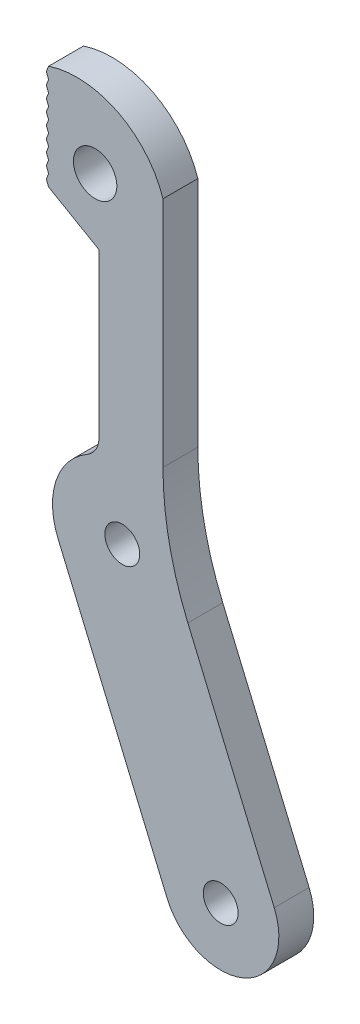
ISO-10303-21;
HEADER;
FILE_DESCRIPTION(('STEP AP214'),'2;1');
FILE_NAME('part.step','',(''),(''),'','','');
FILE_SCHEMA(('AUTOMOTIVE_DESIGN { 1 0 10303 214 1 1 1 1 }'));
ENDSEC;
DATA;
#1=APPLICATION_CONTEXT('core data for automotive mechanical design processes');
#2=APPLICATION_PROTOCOL_DEFINITION('international standard','automotive_design',2000,#1);
#3=PRODUCT_CONTEXT('',#1,'mechanical');
#4=PRODUCT('Part','Part','',(#3));
#5=PRODUCT_RELATED_PRODUCT_CATEGORY('part','',(#4));
#6=PRODUCT_DEFINITION_FORMATION('','',#4);
#7=PRODUCT_DEFINITION_CONTEXT('part definition',#1,'design');
#8=PRODUCT_DEFINITION('design','',#6,#7);
#9=PRODUCT_DEFINITION_SHAPE('','',#8);
#10=(LENGTH_UNIT() NAMED_UNIT(*) SI_UNIT(.MILLI.,.METRE.));
#11=(NAMED_UNIT(*) PLANE_ANGLE_UNIT() SI_UNIT($,.RADIAN.));
#12=(NAMED_UNIT(*) SI_UNIT($,.STERADIAN.) SOLID_ANGLE_UNIT());
#13=UNCERTAINTY_MEASURE_WITH_UNIT(LENGTH_MEASURE(1.E-05),#10,'distance_accuracy_value','');
#14=(GEOMETRIC_REPRESENTATION_CONTEXT(3) GLOBAL_UNCERTAINTY_ASSIGNED_CONTEXT((#13)) GLOBAL_UNIT_ASSIGNED_CONTEXT((#10,
#11,#12)) REPRESENTATION_CONTEXT('',''));
#15=CARTESIAN_POINT('',(0.,0.,0.));
#16=DIRECTION('',(0.,0.,1.));
#17=DIRECTION('',(1.,0.,0.));
#18=AXIS2_PLACEMENT_3D('',#15,#16,#17);
#19=CARTESIAN_POINT('',(18.0632491834591,-3.57873370652173,3.));
#20=DIRECTION('',(0.,0.,-1.));
#21=DIRECTION('',(-1.,0.,0.));
#22=AXIS2_PLACEMENT_3D('',#19,#20,#21);
#23=PLANE('',#22);
#24=CARTESIAN_POINT('',(30.4181785626427,-51.0948843433533,3.));
#25=DIRECTION('',(0.,0.,1.));
#26=DIRECTION('',(1.,0.,0.));
#27=AXIS2_PLACEMENT_3D('',#24,#25,#26);
#28=CIRCLE('',#27,1.5);
#29=CARTESIAN_POINT('',(31.9181785626427,-51.0948843433533,3.));
#30=VERTEX_POINT('',#29);
#31=EDGE_CURVE('E494',#30,#30,#28,.T.);
#32=ORIENTED_EDGE('',*,*,#31,.F.);
#33=EDGE_LOOP('',(#32));
#34=FACE_BOUND('',#33,.T.);
#35=DIRECTION('',(0.86602540378444,-0.499999999999997,0.));
#36=VECTOR('',#35,1.);
#37=CARTESIAN_POINT('',(19.9553284785627,-7.68665441141795,3.));
#38=LINE('',#37,#36);
#39=CARTESIAN_POINT('',(15.6252014596405,-5.18665441141796,3.));
#40=VERTEX_POINT('',#39);
#41=CARTESIAN_POINT('',(19.9553284785627,-7.68665441141795,3.));
#42=VERTEX_POINT('',#41);
#43=EDGE_CURVE('E304',#40,#42,#38,.T.);
#44=ORIENTED_EDGE('',*,*,#43,.T.);
#45=DIRECTION('',(0.,-1.,0.));
#46=VECTOR('',#45,1.);
#47=CARTESIAN_POINT('',(19.9553284785627,-21.6866544114179,3.));
#48=LINE('',#47,#46);
#49=CARTESIAN_POINT('',(19.9553284785627,-21.6866544114179,3.));
#50=VERTEX_POINT('',#49);
#51=EDGE_CURVE('E152',#42,#50,#48,.T.);
#52=ORIENTED_EDGE('',*,*,#51,.T.);
#53=CARTESIAN_POINT('',(17.9553284785627,-21.6866544114179,3.));
#54=DIRECTION('',(0.,0.,-1.));
#55=DIRECTION('',(-1.,0.,0.));
#56=AXIS2_PLACEMENT_3D('',#53,#54,#55);
#57=CIRCLE('',#56,2.);
#58=CARTESIAN_POINT('',(18.9561176597661,-23.418249345225,3.));
#59=VERTEX_POINT('',#58);
#60=EDGE_CURVE('E379',#50,#59,#57,.T.);
#61=ORIENTED_EDGE('',*,*,#60,.T.);
#62=CARTESIAN_POINT('',(21.9584852033763,-28.6130341466461,3.));
#63=DIRECTION('',(0.,0.,1.));
#64=DIRECTION('',(1.,0.,0.));
#65=AXIS2_PLACEMENT_3D('',#62,#63,#64);
#66=CIRCLE('',#65,6.);
#67=CARTESIAN_POINT('',(16.4357325722321,-30.9580721794271,3.));
#68=VERTEX_POINT('',#67);
#69=EDGE_CURVE('E398',#59,#68,#66,.T.);
#70=ORIENTED_EDGE('',*,*,#69,.T.);
#71=DIRECTION('',(0.390839672130157,-0.920458771857377,0.));
#72=VECTOR('',#71,1.);
#73=CARTESIAN_POINT('',(16.4357325722321,-30.9580721794271,3.));
#74=LINE('',#73,#72);
#75=CARTESIAN_POINT('',(25.8158847033558,-53.0490827040041,3.));
#76=VERTEX_POINT('',#75);
#77=EDGE_CURVE('E395',#68,#76,#74,.T.);
#78=ORIENTED_EDGE('',*,*,#77,.T.);
#79=CARTESIAN_POINT('',(30.4181785626427,-51.0948843433533,3.));
#80=DIRECTION('',(0.,0.,1.));
#81=DIRECTION('',(1.,0.,0.));
#82=AXIS2_PLACEMENT_3D('',#79,#80,#81);
#83=CIRCLE('',#82,5.);
#84=CARTESIAN_POINT('',(35.0204724219296,-49.1406859827026,3.));
#85=VERTEX_POINT('',#84);
#86=EDGE_CURVE('E397',#76,#85,#83,.T.);
#87=ORIENTED_EDGE('',*,*,#86,.T.);
#88=DIRECTION('',(-0.390839672130157,0.920458771857378,0.));
#89=VECTOR('',#88,1.);
#90=CARTESIAN_POINT('',(35.0204724219296,-49.1406859827026,3.));
#91=LINE('',#90,#89);
#92=CARTESIAN_POINT('',(27.5945186514566,-31.6519693174124,3.));
#93=VERTEX_POINT('',#92);
#94=EDGE_CURVE('E400',#85,#93,#91,.T.);
#95=ORIENTED_EDGE('',*,*,#94,.T.);
#96=CARTESIAN_POINT('',(52.3494338732919,-21.1406859827026,3.));
#97=DIRECTION('',(0.,0.,-1.));
#98=DIRECTION('',(-1.,0.,0.));
#99=AXIS2_PLACEMENT_3D('',#96,#97,#98);
#100=CIRCLE('',#99,26.8941053947292);
#101=CARTESIAN_POINT('',(25.4553284785627,-21.1406859827026,3.));
#102=VERTEX_POINT('',#101);
#103=EDGE_CURVE('E406',#93,#102,#100,.T.);
#104=ORIENTED_EDGE('',*,*,#103,.T.);
#105=DIRECTION('',(0.,1.,0.));
#106=VECTOR('',#105,1.);
#107=CARTESIAN_POINT('',(25.4553284785627,-21.1406859827026,3.));
#108=LINE('',#107,#106);
#109=CARTESIAN_POINT('',(25.4553284785627,-1.14068598270257,3.));
#110=VERTEX_POINT('',#109);
#111=EDGE_CURVE('E408',#102,#110,#108,.T.);
#112=ORIENTED_EDGE('',*,*,#111,.T.);
#113=CARTESIAN_POINT('',(18.0632491834591,-3.57873370652173,3.));
#114=DIRECTION('',(0.,0.,1.));
#115=DIRECTION('',(-1.,0.,0.));
#116=AXIS2_PLACEMENT_3D('',#113,#114,#115);
#117=CIRCLE('',#116,7.78375956776151);
#118=CARTESIAN_POINT('',(15.6252014596405,3.81334558858203,3.));
#119=VERTEX_POINT('',#118);
#120=EDGE_CURVE('E410',#110,#119,#117,.T.);
#121=ORIENTED_EDGE('',*,*,#120,.T.);
#122=DIRECTION('',(-0.37139067635417,-0.928476690885233,0.));
#123=VECTOR('',#122,1.);
#124=CARTESIAN_POINT('',(15.4252014596405,3.31334558858206,3.));
#125=LINE('',#124,#123);
#126=CARTESIAN_POINT('',(15.4252014596405,3.31334558858206,3.));
#127=VERTEX_POINT('',#126);
#128=EDGE_CURVE('E412',#119,#127,#125,.T.);
#129=ORIENTED_EDGE('',*,*,#128,.T.);
#130=DIRECTION('',(0.371390676354105,-0.928476690885259,0.));
#131=VECTOR('',#130,1.);
#132=CARTESIAN_POINT('',(15.4252014596405,3.31334558858206,3.));
#133=LINE('',#132,#131);
#134=CARTESIAN_POINT('',(15.6252014596405,2.81334558858206,3.));
#135=VERTEX_POINT('',#134);
#136=EDGE_CURVE('E414',#127,#135,#133,.T.);
#137=ORIENTED_EDGE('',*,*,#136,.T.);
#138=DIRECTION('',(-0.371390676354102,-0.92847669088526,0.));
#139=VECTOR('',#138,1.);
#140=CARTESIAN_POINT('',(15.4252014596405,2.31334558858206,3.));
#141=LINE('',#140,#139);
#142=CARTESIAN_POINT('',(15.4252014596405,2.31334558858206,3.));
#143=VERTEX_POINT('',#142);
#144=EDGE_CURVE('E416',#135,#143,#141,.T.);
#145=ORIENTED_EDGE('',*,*,#144,.T.);
#146=DIRECTION('',(0.371390676354105,-0.928476690885259,0.));
#147=VECTOR('',#146,1.);
#148=CARTESIAN_POINT('',(15.4252014596405,2.31334558858206,3.));
#149=LINE('',#148,#147);
#150=CARTESIAN_POINT('',(15.6252014596405,1.81334558858206,3.));
#151=VERTEX_POINT('',#150);
#152=EDGE_CURVE('E418',#143,#151,#149,.T.);
#153=ORIENTED_EDGE('',*,*,#152,.T.);
#154=DIRECTION('',(-0.371390676354102,-0.92847669088526,0.));
#155=VECTOR('',#154,1.);
#156=CARTESIAN_POINT('',(15.4252014596405,1.31334558858206,3.));
#157=LINE('',#156,#155);
#158=CARTESIAN_POINT('',(15.4252014596405,1.31334558858206,3.));
#159=VERTEX_POINT('',#158);
#160=EDGE_CURVE('E420',#151,#159,#157,.T.);
#161=ORIENTED_EDGE('',*,*,#160,.T.);
#162=DIRECTION('',(0.371390676354105,-0.928476690885259,0.));
#163=VECTOR('',#162,1.);
#164=CARTESIAN_POINT('',(15.4252014596405,1.31334558858206,3.));
#165=LINE('',#164,#163);
#166=CARTESIAN_POINT('',(15.6252014596405,0.813345588582054,3.));
#167=VERTEX_POINT('',#166);
#168=EDGE_CURVE('E422',#159,#167,#165,.T.);
#169=ORIENTED_EDGE('',*,*,#168,.T.);
#170=DIRECTION('',(-0.371390676354102,-0.92847669088526,0.));
#171=VECTOR('',#170,1.);
#172=CARTESIAN_POINT('',(15.4252014596405,0.313345588582054,3.));
#173=LINE('',#172,#171);
#174=CARTESIAN_POINT('',(15.4252014596405,0.313345588582054,3.));
#175=VERTEX_POINT('',#174);
#176=EDGE_CURVE('E424',#167,#175,#173,.T.);
#177=ORIENTED_EDGE('',*,*,#176,.T.);
#178=DIRECTION('',(0.371390676354105,-0.928476690885259,0.));
#179=VECTOR('',#178,1.);
#180=CARTESIAN_POINT('',(15.4252014596405,0.313345588582054,3.));
#181=LINE('',#180,#179);
#182=CARTESIAN_POINT('',(15.6252014596405,-0.186654411417949,3.));
#183=VERTEX_POINT('',#182);
#184=EDGE_CURVE('E426',#175,#183,#181,.T.);
#185=ORIENTED_EDGE('',*,*,#184,.T.);
#186=DIRECTION('',(-0.371390676354102,-0.92847669088526,0.));
#187=VECTOR('',#186,1.);
#188=CARTESIAN_POINT('',(15.4252014596405,-0.686654411417948,3.));
#189=LINE('',#188,#187);
#190=CARTESIAN_POINT('',(15.4252014596405,-0.686654411417948,3.));
#191=VERTEX_POINT('',#190);
#192=EDGE_CURVE('E428',#183,#191,#189,.T.);
#193=ORIENTED_EDGE('',*,*,#192,.T.);
#194=DIRECTION('',(0.371390676354105,-0.928476690885259,0.));
#195=VECTOR('',#194,1.);
#196=CARTESIAN_POINT('',(15.4252014596405,-0.686654411417948,3.));
#197=LINE('',#196,#195);
#198=CARTESIAN_POINT('',(15.6252014596405,-1.18665441141795,3.));
#199=VERTEX_POINT('',#198);
#200=EDGE_CURVE('E430',#191,#199,#197,.T.);
#201=ORIENTED_EDGE('',*,*,#200,.T.);
#202=DIRECTION('',(-0.371390676354102,-0.92847669088526,0.));
#203=VECTOR('',#202,1.);
#204=CARTESIAN_POINT('',(15.4252014596405,-1.68665441141795,3.));
#205=LINE('',#204,#203);
#206=CARTESIAN_POINT('',(15.4252014596405,-1.68665441141795,3.));
#207=VERTEX_POINT('',#206);
#208=EDGE_CURVE('E432',#199,#207,#205,.T.);
#209=ORIENTED_EDGE('',*,*,#208,.T.);
#210=DIRECTION('',(0.371390676354105,-0.928476690885259,0.));
#211=VECTOR('',#210,1.);
#212=CARTESIAN_POINT('',(15.4252014596405,-1.68665441141795,3.));
#213=LINE('',#212,#211);
#214=CARTESIAN_POINT('',(15.6252014596405,-2.18665441141796,3.));
#215=VERTEX_POINT('',#214);
#216=EDGE_CURVE('E434',#207,#215,#213,.T.);
#217=ORIENTED_EDGE('',*,*,#216,.T.);
#218=DIRECTION('',(-0.371390676354102,-0.92847669088526,0.));
#219=VECTOR('',#218,1.);
#220=CARTESIAN_POINT('',(15.4252014596405,-2.68665441141795,3.));
#221=LINE('',#220,#219);
#222=CARTESIAN_POINT('',(15.4252014596405,-2.68665441141795,3.));
#223=VERTEX_POINT('',#222);
#224=EDGE_CURVE('E436',#215,#223,#221,.T.);
#225=ORIENTED_EDGE('',*,*,#224,.T.);
#226=DIRECTION('',(0.371390676354105,-0.928476690885259,0.));
#227=VECTOR('',#226,1.);
#228=CARTESIAN_POINT('',(15.4252014596405,-2.68665441141795,3.));
#229=LINE('',#228,#227);
#230=CARTESIAN_POINT('',(15.6252014596405,-3.18665441141796,3.));
#231=VERTEX_POINT('',#230);
#232=EDGE_CURVE('E438',#223,#231,#229,.T.);
#233=ORIENTED_EDGE('',*,*,#232,.T.);
#234=DIRECTION('',(-0.371390676354102,-0.92847669088526,0.));
#235=VECTOR('',#234,1.);
#236=CARTESIAN_POINT('',(15.4252014596405,-3.68665441141796,3.));
#237=LINE('',#236,#235);
#238=CARTESIAN_POINT('',(15.4252014596405,-3.68665441141796,3.));
#239=VERTEX_POINT('',#238);
#240=EDGE_CURVE('E231',#231,#239,#237,.T.);
#241=ORIENTED_EDGE('',*,*,#240,.T.);
#242=DIRECTION('',(0.371390676354105,-0.928476690885259,0.));
#243=VECTOR('',#242,1.);
#244=CARTESIAN_POINT('',(15.4252014596405,-3.68665441141796,3.));
#245=LINE('',#244,#243);
#246=CARTESIAN_POINT('',(15.6252014596405,-4.18665441141796,3.));
#247=VERTEX_POINT('',#246);
#248=EDGE_CURVE('E225',#239,#247,#245,.T.);
#249=ORIENTED_EDGE('',*,*,#248,.T.);
#250=DIRECTION('',(-0.371390676354102,-0.92847669088526,0.));
#251=VECTOR('',#250,1.);
#252=CARTESIAN_POINT('',(15.4252014596405,-4.68665441141796,3.));
#253=LINE('',#252,#251);
#254=CARTESIAN_POINT('',(15.4252014596405,-4.68665441141796,3.));
#255=VERTEX_POINT('',#254);
#256=EDGE_CURVE('E229',#247,#255,#253,.T.);
#257=ORIENTED_EDGE('',*,*,#256,.T.);
#258=DIRECTION('',(0.371390676354102,-0.92847669088526,0.));
#259=VECTOR('',#258,1.);
#260=CARTESIAN_POINT('',(15.4252014596405,-4.68665441141796,3.));
#261=LINE('',#260,#259);
#262=EDGE_CURVE('E49',#255,#40,#261,.T.);
#263=ORIENTED_EDGE('',*,*,#262,.T.);
#264=EDGE_LOOP('',(#44,#52,#61,#70,#78,#87,#95,#104,#112,#121,#129,#137,#145,#153,#161,#169,
#177,#185,#193,#201,#209,#217,#225,#233,#241,#249,#257,#263));
#265=FACE_BOUND('',#264,.T.);
#266=CARTESIAN_POINT('',(21.9584852033763,-28.6130341466461,3.));
#267=DIRECTION('',(0.,0.,1.));
#268=DIRECTION('',(1.,0.,0.));
#269=AXIS2_PLACEMENT_3D('',#266,#267,#268);
#270=CIRCLE('',#269,1.5);
#271=CARTESIAN_POINT('',(23.4584852033763,-28.6130341466461,3.));
#272=VERTEX_POINT('',#271);
#273=EDGE_CURVE('E253',#272,#272,#270,.T.);
#274=ORIENTED_EDGE('',*,*,#273,.F.);
#275=EDGE_LOOP('',(#274));
#276=FACE_BOUND('',#275,.T.);
#277=CARTESIAN_POINT('',(19.6252014596405,-2.18665441141797,3.));
#278=DIRECTION('',(0.,0.,1.));
#279=DIRECTION('',(1.,0.,0.));
#280=AXIS2_PLACEMENT_3D('',#277,#278,#279);
#281=CIRCLE('',#280,1.86677313911568);
#282=CARTESIAN_POINT('',(21.4919745987562,-2.18665441141797,3.));
#283=VERTEX_POINT('',#282);
#284=EDGE_CURVE('E485',#283,#283,#281,.T.);
#285=ORIENTED_EDGE('',*,*,#284,.F.);
#286=EDGE_LOOP('',(#285));
#287=FACE_BOUND('',#286,.T.);
#288=ADVANCED_FACE('F32',(#34,#265,#276,#287),#23,.F.);
#289=CARTESIAN_POINT('',(18.0632491834591,-3.57873370652173,0.));
#290=DIRECTION('',(0.,0.,-1.));
#291=DIRECTION('',(-1.,0.,0.));
#292=AXIS2_PLACEMENT_3D('',#289,#290,#291);
#293=PLANE('',#292);
#294=CARTESIAN_POINT('',(30.4181785626427,-51.0948843433533,0.));
#295=DIRECTION('',(0.,0.,1.));
#296=DIRECTION('',(1.,0.,0.));
#297=AXIS2_PLACEMENT_3D('',#294,#295,#296);
#298=CIRCLE('',#297,1.5);
#299=CARTESIAN_POINT('',(31.9181785626427,-51.0948843433533,0.));
#300=VERTEX_POINT('',#299);
#301=EDGE_CURVE('E491',#300,#300,#298,.T.);
#302=ORIENTED_EDGE('',*,*,#301,.T.);
#303=EDGE_LOOP('',(#302));
#304=FACE_BOUND('',#303,.T.);
#305=DIRECTION('',(0.86602540378444,-0.499999999999997,0.));
#306=VECTOR('',#305,1.);
#307=CARTESIAN_POINT('',(19.9553284785627,-7.68665441141795,0.));
#308=LINE('',#307,#306);
#309=CARTESIAN_POINT('',(15.6252014596405,-5.18665441141796,0.));
#310=VERTEX_POINT('',#309);
#311=CARTESIAN_POINT('',(19.9553284785627,-7.68665441141795,0.));
#312=VERTEX_POINT('',#311);
#313=EDGE_CURVE('E249',#310,#312,#308,.T.);
#314=ORIENTED_EDGE('',*,*,#313,.F.);
#315=DIRECTION('',(0.371390676354102,-0.92847669088526,0.));
#316=VECTOR('',#315,1.);
#317=CARTESIAN_POINT('',(15.4252014596405,-4.68665441141796,0.));
#318=LINE('',#317,#316);
#319=CARTESIAN_POINT('',(15.4252014596405,-4.68665441141796,0.));
#320=VERTEX_POINT('',#319);
#321=EDGE_CURVE('E144',#320,#310,#318,.T.);
#322=ORIENTED_EDGE('',*,*,#321,.F.);
#323=DIRECTION('',(-0.371390676354102,-0.92847669088526,0.));
#324=VECTOR('',#323,1.);
#325=CARTESIAN_POINT('',(15.4252014596405,-4.68665441141796,0.));
#326=LINE('',#325,#324);
#327=CARTESIAN_POINT('',(15.6252014596405,-4.18665441141796,0.));
#328=VERTEX_POINT('',#327);
#329=EDGE_CURVE('E138',#328,#320,#326,.T.);
#330=ORIENTED_EDGE('',*,*,#329,.F.);
#331=DIRECTION('',(0.371390676354105,-0.928476690885259,0.));
#332=VECTOR('',#331,1.);
#333=CARTESIAN_POINT('',(15.4252014596405,-3.68665441141796,0.));
#334=LINE('',#333,#332);
#335=CARTESIAN_POINT('',(15.4252014596405,-3.68665441141796,0.));
#336=VERTEX_POINT('',#335);
#337=EDGE_CURVE('E239',#336,#328,#334,.T.);
#338=ORIENTED_EDGE('',*,*,#337,.F.);
#339=DIRECTION('',(-0.371390676354102,-0.92847669088526,0.));
#340=VECTOR('',#339,1.);
#341=CARTESIAN_POINT('',(15.4252014596405,-3.68665441141796,0.));
#342=LINE('',#341,#340);
#343=CARTESIAN_POINT('',(15.6252014596405,-3.18665441141796,0.));
#344=VERTEX_POINT('',#343);
#345=EDGE_CURVE('E299',#344,#336,#342,.T.);
#346=ORIENTED_EDGE('',*,*,#345,.F.);
#347=DIRECTION('',(0.371390676354105,-0.928476690885259,0.));
#348=VECTOR('',#347,1.);
#349=CARTESIAN_POINT('',(15.4252014596405,-2.68665441141795,0.));
#350=LINE('',#349,#348);
#351=CARTESIAN_POINT('',(15.4252014596405,-2.68665441141795,0.));
#352=VERTEX_POINT('',#351);
#353=EDGE_CURVE('E297',#352,#344,#350,.T.);
#354=ORIENTED_EDGE('',*,*,#353,.F.);
#355=DIRECTION('',(-0.371390676354102,-0.92847669088526,0.));
#356=VECTOR('',#355,1.);
#357=CARTESIAN_POINT('',(15.4252014596405,-2.68665441141795,0.));
#358=LINE('',#357,#356);
#359=CARTESIAN_POINT('',(15.6252014596405,-2.18665441141796,0.));
#360=VERTEX_POINT('',#359);
#361=EDGE_CURVE('E295',#360,#352,#358,.T.);
#362=ORIENTED_EDGE('',*,*,#361,.F.);
#363=DIRECTION('',(0.371390676354105,-0.928476690885259,0.));
#364=VECTOR('',#363,1.);
#365=CARTESIAN_POINT('',(15.4252014596405,-1.68665441141795,0.));
#366=LINE('',#365,#364);
#367=CARTESIAN_POINT('',(15.4252014596405,-1.68665441141795,0.));
#368=VERTEX_POINT('',#367);
#369=EDGE_CURVE('E293',#368,#360,#366,.T.);
#370=ORIENTED_EDGE('',*,*,#369,.F.);
#371=DIRECTION('',(-0.371390676354102,-0.92847669088526,0.));
#372=VECTOR('',#371,1.);
#373=CARTESIAN_POINT('',(15.4252014596405,-1.68665441141795,0.));
#374=LINE('',#373,#372);
#375=CARTESIAN_POINT('',(15.6252014596405,-1.18665441141795,0.));
#376=VERTEX_POINT('',#375);
#377=EDGE_CURVE('E291',#376,#368,#374,.T.);
#378=ORIENTED_EDGE('',*,*,#377,.F.);
#379=DIRECTION('',(0.371390676354105,-0.928476690885259,0.));
#380=VECTOR('',#379,1.);
#381=CARTESIAN_POINT('',(15.4252014596405,-0.686654411417948,0.));
#382=LINE('',#381,#380);
#383=CARTESIAN_POINT('',(15.4252014596405,-0.686654411417948,0.));
#384=VERTEX_POINT('',#383);
#385=EDGE_CURVE('E289',#384,#376,#382,.T.);
#386=ORIENTED_EDGE('',*,*,#385,.F.);
#387=DIRECTION('',(-0.371390676354102,-0.92847669088526,0.));
#388=VECTOR('',#387,1.);
#389=CARTESIAN_POINT('',(15.4252014596405,-0.686654411417948,0.));
#390=LINE('',#389,#388);
#391=CARTESIAN_POINT('',(15.6252014596405,-0.186654411417949,0.));
#392=VERTEX_POINT('',#391);
#393=EDGE_CURVE('E287',#392,#384,#390,.T.);
#394=ORIENTED_EDGE('',*,*,#393,.F.);
#395=DIRECTION('',(0.371390676354105,-0.928476690885259,0.));
#396=VECTOR('',#395,1.);
#397=CARTESIAN_POINT('',(15.4252014596405,0.313345588582054,0.));
#398=LINE('',#397,#396);
#399=CARTESIAN_POINT('',(15.4252014596405,0.313345588582054,0.));
#400=VERTEX_POINT('',#399);
#401=EDGE_CURVE('E285',#400,#392,#398,.T.);
#402=ORIENTED_EDGE('',*,*,#401,.F.);
#403=DIRECTION('',(-0.371390676354102,-0.92847669088526,0.));
#404=VECTOR('',#403,1.);
#405=CARTESIAN_POINT('',(15.4252014596405,0.313345588582054,0.));
#406=LINE('',#405,#404);
#407=CARTESIAN_POINT('',(15.6252014596405,0.813345588582054,0.));
#408=VERTEX_POINT('',#407);
#409=EDGE_CURVE('E283',#408,#400,#406,.T.);
#410=ORIENTED_EDGE('',*,*,#409,.F.);
#411=DIRECTION('',(0.371390676354105,-0.928476690885259,0.));
#412=VECTOR('',#411,1.);
#413=CARTESIAN_POINT('',(15.4252014596405,1.31334558858206,0.));
#414=LINE('',#413,#412);
#415=CARTESIAN_POINT('',(15.4252014596405,1.31334558858206,0.));
#416=VERTEX_POINT('',#415);
#417=EDGE_CURVE('E281',#416,#408,#414,.T.);
#418=ORIENTED_EDGE('',*,*,#417,.F.);
#419=DIRECTION('',(-0.371390676354102,-0.92847669088526,0.));
#420=VECTOR('',#419,1.);
#421=CARTESIAN_POINT('',(15.4252014596405,1.31334558858206,0.));
#422=LINE('',#421,#420);
#423=CARTESIAN_POINT('',(15.6252014596405,1.81334558858206,0.));
#424=VERTEX_POINT('',#423);
#425=EDGE_CURVE('E279',#424,#416,#422,.T.);
#426=ORIENTED_EDGE('',*,*,#425,.F.);
#427=DIRECTION('',(0.371390676354105,-0.928476690885259,0.));
#428=VECTOR('',#427,1.);
#429=CARTESIAN_POINT('',(15.4252014596405,2.31334558858206,0.));
#430=LINE('',#429,#428);
#431=CARTESIAN_POINT('',(15.4252014596405,2.31334558858206,0.));
#432=VERTEX_POINT('',#431);
#433=EDGE_CURVE('E277',#432,#424,#430,.T.);
#434=ORIENTED_EDGE('',*,*,#433,.F.);
#435=DIRECTION('',(-0.371390676354102,-0.92847669088526,0.));
#436=VECTOR('',#435,1.);
#437=CARTESIAN_POINT('',(15.4252014596405,2.31334558858206,0.));
#438=LINE('',#437,#436);
#439=CARTESIAN_POINT('',(15.6252014596405,2.81334558858206,0.));
#440=VERTEX_POINT('',#439);
#441=EDGE_CURVE('E275',#440,#432,#438,.T.);
#442=ORIENTED_EDGE('',*,*,#441,.F.);
#443=DIRECTION('',(0.371390676354105,-0.928476690885259,0.));
#444=VECTOR('',#443,1.);
#445=CARTESIAN_POINT('',(15.4252014596405,3.31334558858206,0.));
#446=LINE('',#445,#444);
#447=CARTESIAN_POINT('',(15.4252014596405,3.31334558858206,0.));
#448=VERTEX_POINT('',#447);
#449=EDGE_CURVE('E273',#448,#440,#446,.T.);
#450=ORIENTED_EDGE('',*,*,#449,.F.);
#451=DIRECTION('',(-0.37139067635417,-0.928476690885233,0.));
#452=VECTOR('',#451,1.);
#453=CARTESIAN_POINT('',(15.4252014596405,3.31334558858206,0.));
#454=LINE('',#453,#452);
#455=CARTESIAN_POINT('',(15.6252014596405,3.81334558858203,0.));
#456=VERTEX_POINT('',#455);
#457=EDGE_CURVE('E271',#456,#448,#454,.T.);
#458=ORIENTED_EDGE('',*,*,#457,.F.);
#459=CARTESIAN_POINT('',(18.0632491834591,-3.57873370652173,0.));
#460=DIRECTION('',(0.,0.,1.));
#461=DIRECTION('',(-1.,0.,0.));
#462=AXIS2_PLACEMENT_3D('',#459,#460,#461);
#463=CIRCLE('',#462,7.78375956776151);
#464=CARTESIAN_POINT('',(25.4553284785627,-1.14068598270257,0.));
#465=VERTEX_POINT('',#464);
#466=EDGE_CURVE('E269',#465,#456,#463,.T.);
#467=ORIENTED_EDGE('',*,*,#466,.F.);
#468=DIRECTION('',(0.,1.,0.));
#469=VECTOR('',#468,1.);
#470=CARTESIAN_POINT('',(25.4553284785627,-21.1406859827026,0.));
#471=LINE('',#470,#469);
#472=CARTESIAN_POINT('',(25.4553284785627,-21.1406859827026,0.));
#473=VERTEX_POINT('',#472);
#474=EDGE_CURVE('E267',#473,#465,#471,.T.);
#475=ORIENTED_EDGE('',*,*,#474,.F.);
#476=CARTESIAN_POINT('',(52.3494338732919,-21.1406859827026,0.));
#477=DIRECTION('',(0.,0.,-1.));
#478=DIRECTION('',(-1.,0.,0.));
#479=AXIS2_PLACEMENT_3D('',#476,#477,#478);
#480=CIRCLE('',#479,26.8941053947292);
#481=CARTESIAN_POINT('',(27.5945186514566,-31.6519693174124,0.));
#482=VERTEX_POINT('',#481);
#483=EDGE_CURVE('E265',#482,#473,#480,.T.);
#484=ORIENTED_EDGE('',*,*,#483,.F.);
#485=DIRECTION('',(-0.390839672130157,0.920458771857378,0.));
#486=VECTOR('',#485,1.);
#487=CARTESIAN_POINT('',(35.0204724219296,-49.1406859827026,0.));
#488=LINE('',#487,#486);
#489=CARTESIAN_POINT('',(35.0204724219296,-49.1406859827026,0.));
#490=VERTEX_POINT('',#489);
#491=EDGE_CURVE('E263',#490,#482,#488,.T.);
#492=ORIENTED_EDGE('',*,*,#491,.F.);
#493=CARTESIAN_POINT('',(30.4181785626427,-51.0948843433533,0.));
#494=DIRECTION('',(0.,0.,1.));
#495=DIRECTION('',(1.,0.,0.));
#496=AXIS2_PLACEMENT_3D('',#493,#494,#495);
#497=CIRCLE('',#496,5.);
#498=CARTESIAN_POINT('',(25.8158847033558,-53.0490827040041,0.));
#499=VERTEX_POINT('',#498);
#500=EDGE_CURVE('E261',#499,#490,#497,.T.);
#501=ORIENTED_EDGE('',*,*,#500,.F.);
#502=DIRECTION('',(0.390839672130157,-0.920458771857377,0.));
#503=VECTOR('',#502,1.);
#504=CARTESIAN_POINT('',(16.4357325722321,-30.9580721794271,0.));
#505=LINE('',#504,#503);
#506=CARTESIAN_POINT('',(16.4357325722321,-30.9580721794271,0.));
#507=VERTEX_POINT('',#506);
#508=EDGE_CURVE('E259',#507,#499,#505,.T.);
#509=ORIENTED_EDGE('',*,*,#508,.F.);
#510=CARTESIAN_POINT('',(21.9584852033763,-28.6130341466461,0.));
#511=DIRECTION('',(0.,0.,1.));
#512=DIRECTION('',(1.,0.,0.));
#513=AXIS2_PLACEMENT_3D('',#510,#511,#512);
#514=CIRCLE('',#513,6.);
#515=CARTESIAN_POINT('',(18.9561176597661,-23.418249345225,0.));
#516=VERTEX_POINT('',#515);
#517=EDGE_CURVE('E257',#516,#507,#514,.T.);
#518=ORIENTED_EDGE('',*,*,#517,.F.);
#519=CARTESIAN_POINT('',(17.9553284785627,-21.6866544114179,0.));
#520=DIRECTION('',(0.,0.,-1.));
#521=DIRECTION('',(-1.,0.,0.));
#522=AXIS2_PLACEMENT_3D('',#519,#520,#521);
#523=CIRCLE('',#522,2.);
#524=CARTESIAN_POINT('',(19.9553284785627,-21.6866544114179,0.));
#525=VERTEX_POINT('',#524);
#526=EDGE_CURVE('E255',#525,#516,#523,.T.);
#527=ORIENTED_EDGE('',*,*,#526,.F.);
#528=DIRECTION('',(0.,-1.,0.));
#529=VECTOR('',#528,1.);
#530=CARTESIAN_POINT('',(19.9553284785627,-21.6866544114179,0.));
#531=LINE('',#530,#529);
#532=EDGE_CURVE('E252',#312,#525,#531,.T.);
#533=ORIENTED_EDGE('',*,*,#532,.F.);
#534=EDGE_LOOP('',(#314,#322,#330,#338,#346,#354,#362,#370,#378,#386,#394,#402,#410,#418,#426,
#434,#442,#450,#458,#467,#475,#484,#492,#501,#509,#518,#527,#533));
#535=FACE_BOUND('',#534,.T.);
#536=CARTESIAN_POINT('',(21.9584852033763,-28.6130341466461,0.));
#537=DIRECTION('',(0.,0.,1.));
#538=DIRECTION('',(1.,0.,0.));
#539=AXIS2_PLACEMENT_3D('',#536,#537,#538);
#540=CIRCLE('',#539,1.5);
#541=CARTESIAN_POINT('',(23.4584852033763,-28.6130341466461,0.));
#542=VERTEX_POINT('',#541);
#543=EDGE_CURVE('E497',#542,#542,#540,.T.);
#544=ORIENTED_EDGE('',*,*,#543,.T.);
#545=EDGE_LOOP('',(#544));
#546=FACE_BOUND('',#545,.T.);
#547=CARTESIAN_POINT('',(19.6252014596405,-2.18665441141797,0.));
#548=DIRECTION('',(0.,0.,1.));
#549=DIRECTION('',(1.,0.,0.));
#550=AXIS2_PLACEMENT_3D('',#547,#548,#549);
#551=CIRCLE('',#550,1.86677313911568);
#552=CARTESIAN_POINT('',(21.4919745987562,-2.18665441141797,0.));
#553=VERTEX_POINT('',#552);
#554=EDGE_CURVE('E488',#553,#553,#551,.T.);
#555=ORIENTED_EDGE('',*,*,#554,.T.);
#556=EDGE_LOOP('',(#555));
#557=FACE_BOUND('',#556,.T.);
#558=ADVANCED_FACE('F383',(#304,#535,#546,#557),#293,.T.);
#559=CARTESIAN_POINT('',(19.9553284785627,-7.68665441141795,3.));
#560=DIRECTION('',(0.499999999999997,0.86602540378444,0.));
#561=DIRECTION('',(-0.86602540378444,0.499999999999997,0.));
#562=AXIS2_PLACEMENT_3D('',#559,#560,#561);
#563=PLANE('',#562);
#564=ORIENTED_EDGE('',*,*,#313,.T.);
#565=DIRECTION('',(0.,0.,-1.));
#566=VECTOR('',#565,1.);
#567=CARTESIAN_POINT('',(19.9553284785627,-7.68665441141795,3.));
#568=LINE('',#567,#566);
#569=EDGE_CURVE('E11',#42,#312,#568,.T.);
#570=ORIENTED_EDGE('',*,*,#569,.F.);
#571=ORIENTED_EDGE('',*,*,#43,.F.);
#572=DIRECTION('',(0.,0.,-1.));
#573=VECTOR('',#572,1.);
#574=CARTESIAN_POINT('',(15.6252014596405,-5.18665441141796,3.));
#575=LINE('',#574,#573);
#576=EDGE_CURVE('E245',#40,#310,#575,.T.);
#577=ORIENTED_EDGE('',*,*,#576,.T.);
#578=EDGE_LOOP('',(#564,#570,#571,#577));
#579=FACE_BOUND('',#578,.T.);
#580=ADVANCED_FACE('F34',(#579),#563,.F.);
#581=CARTESIAN_POINT('',(19.9553284785627,-21.6866544114179,3.));
#582=DIRECTION('',(1.,0.,0.));
#583=DIRECTION('',(0.,1.,0.));
#584=AXIS2_PLACEMENT_3D('',#581,#582,#583);
#585=PLANE('',#584);
#586=ORIENTED_EDGE('',*,*,#532,.T.);
#587=DIRECTION('',(0.,0.,-1.));
#588=VECTOR('',#587,1.);
#589=CARTESIAN_POINT('',(19.9553284785627,-21.6866544114179,3.));
#590=LINE('',#589,#588);
#591=EDGE_CURVE('E41',#50,#525,#590,.T.);
#592=ORIENTED_EDGE('',*,*,#591,.F.);
#593=ORIENTED_EDGE('',*,*,#51,.F.);
#594=ORIENTED_EDGE('',*,*,#569,.T.);
#595=EDGE_LOOP('',(#586,#592,#593,#594));
#596=FACE_BOUND('',#595,.T.);
#597=ADVANCED_FACE('F758',(#596),#585,.F.);
#598=CARTESIAN_POINT('',(17.9553284785627,-21.6866544114179,3.));
#599=DIRECTION('',(0.,0.,-1.));
#600=DIRECTION('',(-1.,0.,0.));
#601=AXIS2_PLACEMENT_3D('',#598,#599,#600);
#602=CYLINDRICAL_SURFACE('',#601,2.);
#603=ORIENTED_EDGE('',*,*,#526,.T.);
#604=DIRECTION('',(0.,0.,-1.));
#605=VECTOR('',#604,1.);
#606=CARTESIAN_POINT('',(18.9561176597661,-23.418249345225,3.));
#607=LINE('',#606,#605);
#608=EDGE_CURVE('E371',#59,#516,#607,.T.);
#609=ORIENTED_EDGE('',*,*,#608,.F.);
#610=ORIENTED_EDGE('',*,*,#60,.F.);
#611=ORIENTED_EDGE('',*,*,#591,.T.);
#612=EDGE_LOOP('',(#603,#609,#610,#611));
#613=FACE_BOUND('',#612,.T.);
#614=ADVANCED_FACE('F377',(#613),#602,.F.);
#615=CARTESIAN_POINT('',(21.9584852033763,-28.6130341466461,3.));
#616=DIRECTION('',(0.,0.,-1.));
#617=DIRECTION('',(-1.,0.,0.));
#618=AXIS2_PLACEMENT_3D('',#615,#616,#617);
#619=CYLINDRICAL_SURFACE('',#618,6.);
#620=ORIENTED_EDGE('',*,*,#517,.T.);
#621=DIRECTION('',(0.,0.,-1.));
#622=VECTOR('',#621,1.);
#623=CARTESIAN_POINT('',(16.4357325722321,-30.9580721794271,3.));
#624=LINE('',#623,#622);
#625=EDGE_CURVE('E368',#68,#507,#624,.T.);
#626=ORIENTED_EDGE('',*,*,#625,.F.);
#627=ORIENTED_EDGE('',*,*,#69,.F.);
#628=ORIENTED_EDGE('',*,*,#608,.T.);
#629=EDGE_LOOP('',(#620,#626,#627,#628));
#630=FACE_BOUND('',#629,.T.);
#631=ADVANCED_FACE('F389',(#630),#619,.T.);
#632=CARTESIAN_POINT('',(16.4357325722321,-30.9580721794271,3.));
#633=DIRECTION('',(0.920458771857377,0.390839672130157,0.));
#634=DIRECTION('',(-0.390839672130157,0.920458771857378,0.));
#635=AXIS2_PLACEMENT_3D('',#632,#633,#634);
#636=PLANE('',#635);
#637=ORIENTED_EDGE('',*,*,#508,.T.);
#638=DIRECTION('',(0.,0.,-1.));
#639=VECTOR('',#638,1.);
#640=CARTESIAN_POINT('',(25.8158847033558,-53.0490827040041,3.));
#641=LINE('',#640,#639);
#642=EDGE_CURVE('E365',#76,#499,#641,.T.);
#643=ORIENTED_EDGE('',*,*,#642,.F.);
#644=ORIENTED_EDGE('',*,*,#77,.F.);
#645=ORIENTED_EDGE('',*,*,#625,.T.);
#646=EDGE_LOOP('',(#637,#643,#644,#645));
#647=FACE_BOUND('',#646,.T.);
#648=ADVANCED_FACE('F393',(#647),#636,.F.);
#649=CARTESIAN_POINT('',(30.4181785626427,-51.0948843433533,3.));
#650=DIRECTION('',(0.,0.,-1.));
#651=DIRECTION('',(-1.,0.,0.));
#652=AXIS2_PLACEMENT_3D('',#649,#650,#651);
#653=CYLINDRICAL_SURFACE('',#652,5.);
#654=ORIENTED_EDGE('',*,*,#500,.T.);
#655=DIRECTION('',(0.,0.,-1.));
#656=VECTOR('',#655,1.);
#657=CARTESIAN_POINT('',(35.0204724219296,-49.1406859827026,3.));
#658=LINE('',#657,#656);
#659=EDGE_CURVE('E362',#85,#490,#658,.T.);
#660=ORIENTED_EDGE('',*,*,#659,.F.);
#661=ORIENTED_EDGE('',*,*,#86,.F.);
#662=ORIENTED_EDGE('',*,*,#642,.T.);
#663=EDGE_LOOP('',(#654,#660,#661,#662));
#664=FACE_BOUND('',#663,.T.);
#665=ADVANCED_FACE('F723',(#664),#653,.T.);
#666=CARTESIAN_POINT('',(35.0204724219296,-49.1406859827026,3.));
#667=DIRECTION('',(-0.920458771857377,-0.390839672130157,0.));
#668=DIRECTION('',(0.390839672130157,-0.920458771857377,0.));
#669=AXIS2_PLACEMENT_3D('',#666,#667,#668);
#670=PLANE('',#669);
#671=ORIENTED_EDGE('',*,*,#491,.T.);
#672=DIRECTION('',(0.,0.,-1.));
#673=VECTOR('',#672,1.);
#674=CARTESIAN_POINT('',(27.5945186514566,-31.6519693174124,3.));
#675=LINE('',#674,#673);
#676=EDGE_CURVE('E359',#93,#482,#675,.T.);
#677=ORIENTED_EDGE('',*,*,#676,.F.);
#678=ORIENTED_EDGE('',*,*,#94,.F.);
#679=ORIENTED_EDGE('',*,*,#659,.T.);
#680=EDGE_LOOP('',(#671,#677,#678,#679));
#681=FACE_BOUND('',#680,.T.);
#682=ADVANCED_FACE('F713',(#681),#670,.F.);
#683=CARTESIAN_POINT('',(52.3494338732919,-21.1406859827026,3.));
#684=DIRECTION('',(0.,0.,-1.));
#685=DIRECTION('',(-1.,0.,0.));
#686=AXIS2_PLACEMENT_3D('',#683,#684,#685);
#687=CYLINDRICAL_SURFACE('',#686,26.8941053947292);
#688=ORIENTED_EDGE('',*,*,#483,.T.);
#689=DIRECTION('',(0.,0.,-1.));
#690=VECTOR('',#689,1.);
#691=CARTESIAN_POINT('',(25.4553284785627,-21.1406859827026,3.));
#692=LINE('',#691,#690);
#693=EDGE_CURVE('E356',#102,#473,#692,.T.);
#694=ORIENTED_EDGE('',*,*,#693,.F.);
#695=ORIENTED_EDGE('',*,*,#103,.F.);
#696=ORIENTED_EDGE('',*,*,#676,.T.);
#697=EDGE_LOOP('',(#688,#694,#695,#696));
#698=FACE_BOUND('',#697,.T.);
#699=ADVANCED_FACE('F703',(#698),#687,.F.);
#700=CARTESIAN_POINT('',(25.4553284785627,-21.1406859827026,3.));
#701=DIRECTION('',(-1.,0.,0.));
#702=DIRECTION('',(0.,0.,1.));
#703=AXIS2_PLACEMENT_3D('',#700,#701,#702);
#704=PLANE('',#703);
#705=ORIENTED_EDGE('',*,*,#474,.T.);
#706=DIRECTION('',(0.,0.,-1.));
#707=VECTOR('',#706,1.);
#708=CARTESIAN_POINT('',(25.4553284785627,-1.14068598270257,3.));
#709=LINE('',#708,#707);
#710=EDGE_CURVE('E353',#110,#465,#709,.T.);
#711=ORIENTED_EDGE('',*,*,#710,.F.);
#712=ORIENTED_EDGE('',*,*,#111,.F.);
#713=ORIENTED_EDGE('',*,*,#693,.T.);
#714=EDGE_LOOP('',(#705,#711,#712,#713));
#715=FACE_BOUND('',#714,.T.);
#716=ADVANCED_FACE('F693',(#715),#704,.F.);
#717=CARTESIAN_POINT('',(18.0632491834591,-3.57873370652173,3.));
#718=DIRECTION('',(0.,0.,-1.));
#719=DIRECTION('',(-1.,0.,0.));
#720=AXIS2_PLACEMENT_3D('',#717,#718,#719);
#721=CYLINDRICAL_SURFACE('',#720,7.78375956776151);
#722=ORIENTED_EDGE('',*,*,#466,.T.);
#723=DIRECTION('',(0.,0.,-1.));
#724=VECTOR('',#723,1.);
#725=CARTESIAN_POINT('',(15.6252014596405,3.81334558858203,3.));
#726=LINE('',#725,#724);
#727=EDGE_CURVE('E350',#119,#456,#726,.T.);
#728=ORIENTED_EDGE('',*,*,#727,.F.);
#729=ORIENTED_EDGE('',*,*,#120,.F.);
#730=ORIENTED_EDGE('',*,*,#710,.T.);
#731=EDGE_LOOP('',(#722,#728,#729,#730));
#732=FACE_BOUND('',#731,.T.);
#733=ADVANCED_FACE('F683',(#732),#721,.T.);
#734=CARTESIAN_POINT('',(15.4252014596405,3.31334558858206,3.));
#735=DIRECTION('',(0.928476690885233,-0.37139067635417,0.));
#736=DIRECTION('',(0.37139067635417,0.928476690885233,0.));
#737=AXIS2_PLACEMENT_3D('',#734,#735,#736);
#738=PLANE('',#737);
#739=ORIENTED_EDGE('',*,*,#457,.T.);
#740=DIRECTION('',(0.,0.,-1.));
#741=VECTOR('',#740,1.);
#742=CARTESIAN_POINT('',(15.4252014596405,3.31334558858206,3.));
#743=LINE('',#742,#741);
#744=EDGE_CURVE('E347',#127,#448,#743,.T.);
#745=ORIENTED_EDGE('',*,*,#744,.F.);
#746=ORIENTED_EDGE('',*,*,#128,.F.);
#747=ORIENTED_EDGE('',*,*,#727,.T.);
#748=EDGE_LOOP('',(#739,#745,#746,#747));
#749=FACE_BOUND('',#748,.T.);
#750=ADVANCED_FACE('F673',(#749),#738,.F.);
#751=CARTESIAN_POINT('',(15.4252014596405,3.31334558858206,3.));
#752=DIRECTION('',(0.928476690885259,0.371390676354105,0.));
#753=DIRECTION('',(-0.371390676354105,0.928476690885259,0.));
#754=AXIS2_PLACEMENT_3D('',#751,#752,#753);
#755=PLANE('',#754);
#756=ORIENTED_EDGE('',*,*,#449,.T.);
#757=DIRECTION('',(0.,0.,-1.));
#758=VECTOR('',#757,1.);
#759=CARTESIAN_POINT('',(15.6252014596405,2.81334558858206,3.));
#760=LINE('',#759,#758);
#761=EDGE_CURVE('E344',#135,#440,#760,.T.);
#762=ORIENTED_EDGE('',*,*,#761,.F.);
#763=ORIENTED_EDGE('',*,*,#136,.F.);
#764=ORIENTED_EDGE('',*,*,#744,.T.);
#765=EDGE_LOOP('',(#756,#762,#763,#764));
#766=FACE_BOUND('',#765,.T.);
#767=ADVANCED_FACE('F663',(#766),#755,.F.);
#768=CARTESIAN_POINT('',(15.4252014596405,2.31334558858206,3.));
#769=DIRECTION('',(0.92847669088526,-0.371390676354102,0.));
#770=DIRECTION('',(0.371390676354102,0.92847669088526,0.));
#771=AXIS2_PLACEMENT_3D('',#768,#769,#770);
#772=PLANE('',#771);
#773=ORIENTED_EDGE('',*,*,#441,.T.);
#774=DIRECTION('',(0.,0.,-1.));
#775=VECTOR('',#774,1.);
#776=CARTESIAN_POINT('',(15.4252014596405,2.31334558858206,3.));
#777=LINE('',#776,#775);
#778=EDGE_CURVE('E341',#143,#432,#777,.T.);
#779=ORIENTED_EDGE('',*,*,#778,.F.);
#780=ORIENTED_EDGE('',*,*,#144,.F.);
#781=ORIENTED_EDGE('',*,*,#761,.T.);
#782=EDGE_LOOP('',(#773,#779,#780,#781));
#783=FACE_BOUND('',#782,.T.);
#784=ADVANCED_FACE('F653',(#783),#772,.F.);
#785=CARTESIAN_POINT('',(15.4252014596405,2.31334558858206,3.));
#786=DIRECTION('',(0.928476690885259,0.371390676354105,0.));
#787=DIRECTION('',(-0.371390676354105,0.928476690885259,0.));
#788=AXIS2_PLACEMENT_3D('',#785,#786,#787);
#789=PLANE('',#788);
#790=ORIENTED_EDGE('',*,*,#433,.T.);
#791=DIRECTION('',(0.,0.,-1.));
#792=VECTOR('',#791,1.);
#793=CARTESIAN_POINT('',(15.6252014596405,1.81334558858206,3.));
#794=LINE('',#793,#792);
#795=EDGE_CURVE('E338',#151,#424,#794,.T.);
#796=ORIENTED_EDGE('',*,*,#795,.F.);
#797=ORIENTED_EDGE('',*,*,#152,.F.);
#798=ORIENTED_EDGE('',*,*,#778,.T.);
#799=EDGE_LOOP('',(#790,#796,#797,#798));
#800=FACE_BOUND('',#799,.T.);
#801=ADVANCED_FACE('F643',(#800),#789,.F.);
#802=CARTESIAN_POINT('',(15.4252014596405,1.31334558858206,3.));
#803=DIRECTION('',(0.92847669088526,-0.371390676354102,0.));
#804=DIRECTION('',(0.371390676354102,0.92847669088526,0.));
#805=AXIS2_PLACEMENT_3D('',#802,#803,#804);
#806=PLANE('',#805);
#807=ORIENTED_EDGE('',*,*,#425,.T.);
#808=DIRECTION('',(0.,0.,-1.));
#809=VECTOR('',#808,1.);
#810=CARTESIAN_POINT('',(15.4252014596405,1.31334558858206,3.));
#811=LINE('',#810,#809);
#812=EDGE_CURVE('E335',#159,#416,#811,.T.);
#813=ORIENTED_EDGE('',*,*,#812,.F.);
#814=ORIENTED_EDGE('',*,*,#160,.F.);
#815=ORIENTED_EDGE('',*,*,#795,.T.);
#816=EDGE_LOOP('',(#807,#813,#814,#815));
#817=FACE_BOUND('',#816,.T.);
#818=ADVANCED_FACE('F633',(#817),#806,.F.);
#819=CARTESIAN_POINT('',(15.4252014596405,1.31334558858206,3.));
#820=DIRECTION('',(0.928476690885259,0.371390676354105,0.));
#821=DIRECTION('',(-0.371390676354105,0.928476690885259,0.));
#822=AXIS2_PLACEMENT_3D('',#819,#820,#821);
#823=PLANE('',#822);
#824=ORIENTED_EDGE('',*,*,#417,.T.);
#825=DIRECTION('',(0.,0.,-1.));
#826=VECTOR('',#825,1.);
#827=CARTESIAN_POINT('',(15.6252014596405,0.813345588582054,3.));
#828=LINE('',#827,#826);
#829=EDGE_CURVE('E332',#167,#408,#828,.T.);
#830=ORIENTED_EDGE('',*,*,#829,.F.);
#831=ORIENTED_EDGE('',*,*,#168,.F.);
#832=ORIENTED_EDGE('',*,*,#812,.T.);
#833=EDGE_LOOP('',(#824,#830,#831,#832));
#834=FACE_BOUND('',#833,.T.);
#835=ADVANCED_FACE('F623',(#834),#823,.F.);
#836=CARTESIAN_POINT('',(15.4252014596405,0.313345588582054,3.));
#837=DIRECTION('',(0.92847669088526,-0.371390676354102,0.));
#838=DIRECTION('',(0.371390676354102,0.92847669088526,0.));
#839=AXIS2_PLACEMENT_3D('',#836,#837,#838);
#840=PLANE('',#839);
#841=ORIENTED_EDGE('',*,*,#409,.T.);
#842=DIRECTION('',(0.,0.,-1.));
#843=VECTOR('',#842,1.);
#844=CARTESIAN_POINT('',(15.4252014596405,0.313345588582054,3.));
#845=LINE('',#844,#843);
#846=EDGE_CURVE('E329',#175,#400,#845,.T.);
#847=ORIENTED_EDGE('',*,*,#846,.F.);
#848=ORIENTED_EDGE('',*,*,#176,.F.);
#849=ORIENTED_EDGE('',*,*,#829,.T.);
#850=EDGE_LOOP('',(#841,#847,#848,#849));
#851=FACE_BOUND('',#850,.T.);
#852=ADVANCED_FACE('F613',(#851),#840,.F.);
#853=CARTESIAN_POINT('',(15.4252014596405,0.313345588582054,3.));
#854=DIRECTION('',(0.928476690885259,0.371390676354105,0.));
#855=DIRECTION('',(-0.371390676354105,0.928476690885259,0.));
#856=AXIS2_PLACEMENT_3D('',#853,#854,#855);
#857=PLANE('',#856);
#858=ORIENTED_EDGE('',*,*,#401,.T.);
#859=DIRECTION('',(0.,0.,-1.));
#860=VECTOR('',#859,1.);
#861=CARTESIAN_POINT('',(15.6252014596405,-0.186654411417949,3.));
#862=LINE('',#861,#860);
#863=EDGE_CURVE('E326',#183,#392,#862,.T.);
#864=ORIENTED_EDGE('',*,*,#863,.F.);
#865=ORIENTED_EDGE('',*,*,#184,.F.);
#866=ORIENTED_EDGE('',*,*,#846,.T.);
#867=EDGE_LOOP('',(#858,#864,#865,#866));
#868=FACE_BOUND('',#867,.T.);
#869=ADVANCED_FACE('F603',(#868),#857,.F.);
#870=CARTESIAN_POINT('',(15.4252014596405,-0.686654411417948,3.));
#871=DIRECTION('',(0.92847669088526,-0.371390676354102,0.));
#872=DIRECTION('',(0.371390676354102,0.92847669088526,0.));
#873=AXIS2_PLACEMENT_3D('',#870,#871,#872);
#874=PLANE('',#873);
#875=ORIENTED_EDGE('',*,*,#393,.T.);
#876=DIRECTION('',(0.,0.,-1.));
#877=VECTOR('',#876,1.);
#878=CARTESIAN_POINT('',(15.4252014596405,-0.686654411417948,3.));
#879=LINE('',#878,#877);
#880=EDGE_CURVE('E323',#191,#384,#879,.T.);
#881=ORIENTED_EDGE('',*,*,#880,.F.);
#882=ORIENTED_EDGE('',*,*,#192,.F.);
#883=ORIENTED_EDGE('',*,*,#863,.T.);
#884=EDGE_LOOP('',(#875,#881,#882,#883));
#885=FACE_BOUND('',#884,.T.);
#886=ADVANCED_FACE('F593',(#885),#874,.F.);
#887=CARTESIAN_POINT('',(15.4252014596405,-0.686654411417948,3.));
#888=DIRECTION('',(0.928476690885259,0.371390676354105,0.));
#889=DIRECTION('',(-0.371390676354105,0.928476690885259,0.));
#890=AXIS2_PLACEMENT_3D('',#887,#888,#889);
#891=PLANE('',#890);
#892=ORIENTED_EDGE('',*,*,#385,.T.);
#893=DIRECTION('',(0.,0.,-1.));
#894=VECTOR('',#893,1.);
#895=CARTESIAN_POINT('',(15.6252014596405,-1.18665441141795,3.));
#896=LINE('',#895,#894);
#897=EDGE_CURVE('E320',#199,#376,#896,.T.);
#898=ORIENTED_EDGE('',*,*,#897,.F.);
#899=ORIENTED_EDGE('',*,*,#200,.F.);
#900=ORIENTED_EDGE('',*,*,#880,.T.);
#901=EDGE_LOOP('',(#892,#898,#899,#900));
#902=FACE_BOUND('',#901,.T.);
#903=ADVANCED_FACE('F583',(#902),#891,.F.);
#904=CARTESIAN_POINT('',(15.4252014596405,-1.68665441141795,3.));
#905=DIRECTION('',(0.92847669088526,-0.371390676354102,0.));
#906=DIRECTION('',(0.371390676354102,0.92847669088526,0.));
#907=AXIS2_PLACEMENT_3D('',#904,#905,#906);
#908=PLANE('',#907);
#909=ORIENTED_EDGE('',*,*,#377,.T.);
#910=DIRECTION('',(0.,0.,-1.));
#911=VECTOR('',#910,1.);
#912=CARTESIAN_POINT('',(15.4252014596405,-1.68665441141795,3.));
#913=LINE('',#912,#911);
#914=EDGE_CURVE('E317',#207,#368,#913,.T.);
#915=ORIENTED_EDGE('',*,*,#914,.F.);
#916=ORIENTED_EDGE('',*,*,#208,.F.);
#917=ORIENTED_EDGE('',*,*,#897,.T.);
#918=EDGE_LOOP('',(#909,#915,#916,#917));
#919=FACE_BOUND('',#918,.T.);
#920=ADVANCED_FACE('F573',(#919),#908,.F.);
#921=CARTESIAN_POINT('',(15.4252014596405,-1.68665441141795,3.));
#922=DIRECTION('',(0.928476690885259,0.371390676354105,0.));
#923=DIRECTION('',(-0.371390676354105,0.928476690885259,0.));
#924=AXIS2_PLACEMENT_3D('',#921,#922,#923);
#925=PLANE('',#924);
#926=ORIENTED_EDGE('',*,*,#369,.T.);
#927=DIRECTION('',(0.,0.,-1.));
#928=VECTOR('',#927,1.);
#929=CARTESIAN_POINT('',(15.6252014596405,-2.18665441141796,3.));
#930=LINE('',#929,#928);
#931=EDGE_CURVE('E314',#215,#360,#930,.T.);
#932=ORIENTED_EDGE('',*,*,#931,.F.);
#933=ORIENTED_EDGE('',*,*,#216,.F.);
#934=ORIENTED_EDGE('',*,*,#914,.T.);
#935=EDGE_LOOP('',(#926,#932,#933,#934));
#936=FACE_BOUND('',#935,.T.);
#937=ADVANCED_FACE('F563',(#936),#925,.F.);
#938=CARTESIAN_POINT('',(15.4252014596405,-2.68665441141795,3.));
#939=DIRECTION('',(0.92847669088526,-0.371390676354102,0.));
#940=DIRECTION('',(0.371390676354102,0.92847669088526,0.));
#941=AXIS2_PLACEMENT_3D('',#938,#939,#940);
#942=PLANE('',#941);
#943=ORIENTED_EDGE('',*,*,#361,.T.);
#944=DIRECTION('',(0.,0.,-1.));
#945=VECTOR('',#944,1.);
#946=CARTESIAN_POINT('',(15.4252014596405,-2.68665441141795,3.));
#947=LINE('',#946,#945);
#948=EDGE_CURVE('E311',#223,#352,#947,.T.);
#949=ORIENTED_EDGE('',*,*,#948,.F.);
#950=ORIENTED_EDGE('',*,*,#224,.F.);
#951=ORIENTED_EDGE('',*,*,#931,.T.);
#952=EDGE_LOOP('',(#943,#949,#950,#951));
#953=FACE_BOUND('',#952,.T.);
#954=ADVANCED_FACE('F554',(#953),#942,.F.);
#955=CARTESIAN_POINT('',(15.4252014596405,-2.68665441141795,3.));
#956=DIRECTION('',(0.928476690885259,0.371390676354105,0.));
#957=DIRECTION('',(-0.371390676354105,0.928476690885259,0.));
#958=AXIS2_PLACEMENT_3D('',#955,#956,#957);
#959=PLANE('',#958);
#960=ORIENTED_EDGE('',*,*,#353,.T.);
#961=DIRECTION('',(0.,0.,-1.));
#962=VECTOR('',#961,1.);
#963=CARTESIAN_POINT('',(15.6252014596405,-3.18665441141796,3.));
#964=LINE('',#963,#962);
#965=EDGE_CURVE('E308',#231,#344,#964,.T.);
#966=ORIENTED_EDGE('',*,*,#965,.F.);
#967=ORIENTED_EDGE('',*,*,#232,.F.);
#968=ORIENTED_EDGE('',*,*,#948,.T.);
#969=EDGE_LOOP('',(#960,#966,#967,#968));
#970=FACE_BOUND('',#969,.T.);
#971=ADVANCED_FACE('F444',(#970),#959,.F.);
#972=CARTESIAN_POINT('',(15.4252014596405,-3.68665441141796,3.));
#973=DIRECTION('',(0.92847669088526,-0.371390676354102,0.));
#974=DIRECTION('',(0.371390676354102,0.92847669088526,0.));
#975=AXIS2_PLACEMENT_3D('',#972,#973,#974);
#976=PLANE('',#975);
#977=ORIENTED_EDGE('',*,*,#345,.T.);
#978=DIRECTION('',(0.,0.,-1.));
#979=VECTOR('',#978,1.);
#980=CARTESIAN_POINT('',(15.4252014596405,-3.68665441141796,3.));
#981=LINE('',#980,#979);
#982=EDGE_CURVE('E240',#239,#336,#981,.T.);
#983=ORIENTED_EDGE('',*,*,#982,.F.);
#984=ORIENTED_EDGE('',*,*,#240,.F.);
#985=ORIENTED_EDGE('',*,*,#965,.T.);
#986=EDGE_LOOP('',(#977,#983,#984,#985));
#987=FACE_BOUND('',#986,.T.);
#988=ADVANCED_FACE('F448',(#987),#976,.F.);
#989=CARTESIAN_POINT('',(15.4252014596405,-3.68665441141796,3.));
#990=DIRECTION('',(0.928476690885259,0.371390676354105,0.));
#991=DIRECTION('',(-0.371390676354105,0.928476690885259,0.));
#992=AXIS2_PLACEMENT_3D('',#989,#990,#991);
#993=PLANE('',#992);
#994=ORIENTED_EDGE('',*,*,#337,.T.);
#995=DIRECTION('',(0.,0.,-1.));
#996=VECTOR('',#995,1.);
#997=CARTESIAN_POINT('',(15.6252014596405,-4.18665441141796,3.));
#998=LINE('',#997,#996);
#999=EDGE_CURVE('E236',#247,#328,#998,.T.);
#1000=ORIENTED_EDGE('',*,*,#999,.F.);
#1001=ORIENTED_EDGE('',*,*,#248,.F.);
#1002=ORIENTED_EDGE('',*,*,#982,.T.);
#1003=EDGE_LOOP('',(#994,#1000,#1001,#1002));
#1004=FACE_BOUND('',#1003,.T.);
#1005=ADVANCED_FACE('F237',(#1004),#993,.F.);
#1006=CARTESIAN_POINT('',(15.4252014596405,-4.68665441141796,3.));
#1007=DIRECTION('',(0.92847669088526,-0.371390676354102,0.));
#1008=DIRECTION('',(0.371390676354102,0.92847669088526,0.));
#1009=AXIS2_PLACEMENT_3D('',#1006,#1007,#1008);
#1010=PLANE('',#1009);
#1011=ORIENTED_EDGE('',*,*,#329,.T.);
#1012=DIRECTION('',(0.,0.,-1.));
#1013=VECTOR('',#1012,1.);
#1014=CARTESIAN_POINT('',(15.4252014596405,-4.68665441141796,3.));
#1015=LINE('',#1014,#1013);
#1016=EDGE_CURVE('E241',#255,#320,#1015,.T.);
#1017=ORIENTED_EDGE('',*,*,#1016,.F.);
#1018=ORIENTED_EDGE('',*,*,#256,.F.);
#1019=ORIENTED_EDGE('',*,*,#999,.T.);
#1020=EDGE_LOOP('',(#1011,#1017,#1018,#1019));
#1021=FACE_BOUND('',#1020,.T.);
#1022=ADVANCED_FACE('F243',(#1021),#1010,.F.);
#1023=CARTESIAN_POINT('',(15.4252014596405,-4.68665441141796,3.));
#1024=DIRECTION('',(0.92847669088526,0.371390676354102,0.));
#1025=DIRECTION('',(-0.371390676354102,0.92847669088526,0.));
#1026=AXIS2_PLACEMENT_3D('',#1023,#1024,#1025);
#1027=PLANE('',#1026);
#1028=ORIENTED_EDGE('',*,*,#321,.T.);
#1029=ORIENTED_EDGE('',*,*,#576,.F.);
#1030=ORIENTED_EDGE('',*,*,#262,.F.);
#1031=ORIENTED_EDGE('',*,*,#1016,.T.);
#1032=EDGE_LOOP('',(#1028,#1029,#1030,#1031));
#1033=FACE_BOUND('',#1032,.T.);
#1034=ADVANCED_FACE('F452',(#1033),#1027,.F.);
#1035=CARTESIAN_POINT('',(21.9584852033763,-28.6130341466461,3.));
#1036=DIRECTION('',(0.,0.,-1.));
#1037=DIRECTION('',(-1.,0.,0.));
#1038=AXIS2_PLACEMENT_3D('',#1035,#1036,#1037);
#1039=CYLINDRICAL_SURFACE('',#1038,1.5);
#1040=ORIENTED_EDGE('',*,*,#273,.T.);
#1041=EDGE_LOOP('',(#1040));
#1042=FACE_BOUND('',#1041,.T.);
#1043=ORIENTED_EDGE('',*,*,#543,.F.);
#1044=EDGE_LOOP('',(#1043));
#1045=FACE_BOUND('',#1044,.T.);
#1046=ADVANCED_FACE('F454',(#1042,#1045),#1039,.F.);
#1047=CARTESIAN_POINT('',(30.4181785626427,-51.0948843433533,3.));
#1048=DIRECTION('',(0.,0.,-1.));
#1049=DIRECTION('',(-1.,0.,0.));
#1050=AXIS2_PLACEMENT_3D('',#1047,#1048,#1049);
#1051=CYLINDRICAL_SURFACE('',#1050,1.5);
#1052=ORIENTED_EDGE('',*,*,#31,.T.);
#1053=EDGE_LOOP('',(#1052));
#1054=FACE_BOUND('',#1053,.T.);
#1055=ORIENTED_EDGE('',*,*,#301,.F.);
#1056=EDGE_LOOP('',(#1055));
#1057=FACE_BOUND('',#1056,.T.);
#1058=ADVANCED_FACE('F460',(#1054,#1057),#1051,.F.);
#1059=CARTESIAN_POINT('',(19.6252014596405,-2.18665441141797,3.));
#1060=DIRECTION('',(0.,0.,-1.));
#1061=DIRECTION('',(-1.,0.,0.));
#1062=AXIS2_PLACEMENT_3D('',#1059,#1060,#1061);
#1063=CYLINDRICAL_SURFACE('',#1062,1.86677313911568);
#1064=ORIENTED_EDGE('',*,*,#284,.T.);
#1065=EDGE_LOOP('',(#1064));
#1066=FACE_BOUND('',#1065,.T.);
#1067=ORIENTED_EDGE('',*,*,#554,.F.);
#1068=EDGE_LOOP('',(#1067));
#1069=FACE_BOUND('',#1068,.T.);
#1070=ADVANCED_FACE('F476',(#1066,#1069),#1063,.F.);
#1071=CLOSED_SHELL('',(#288,#558,#580,#597,#614,#631,#648,#665,#682,#699,#716,#733,#750,#767,
#784,#801,#818,#835,#852,#869,#886,#903,#920,#937,#954,#971,#988,#1005,#1022,#1034,#1046,#1058,#1070));
#1072=MANIFOLD_SOLID_BREP('B2',#1071);
#1073=ADVANCED_BREP_SHAPE_REPRESENTATION('',(#18,#1072),#14);
#1074=SHAPE_DEFINITION_REPRESENTATION(#9,#1073);
ENDSEC;
END-ISO-10303-21;
